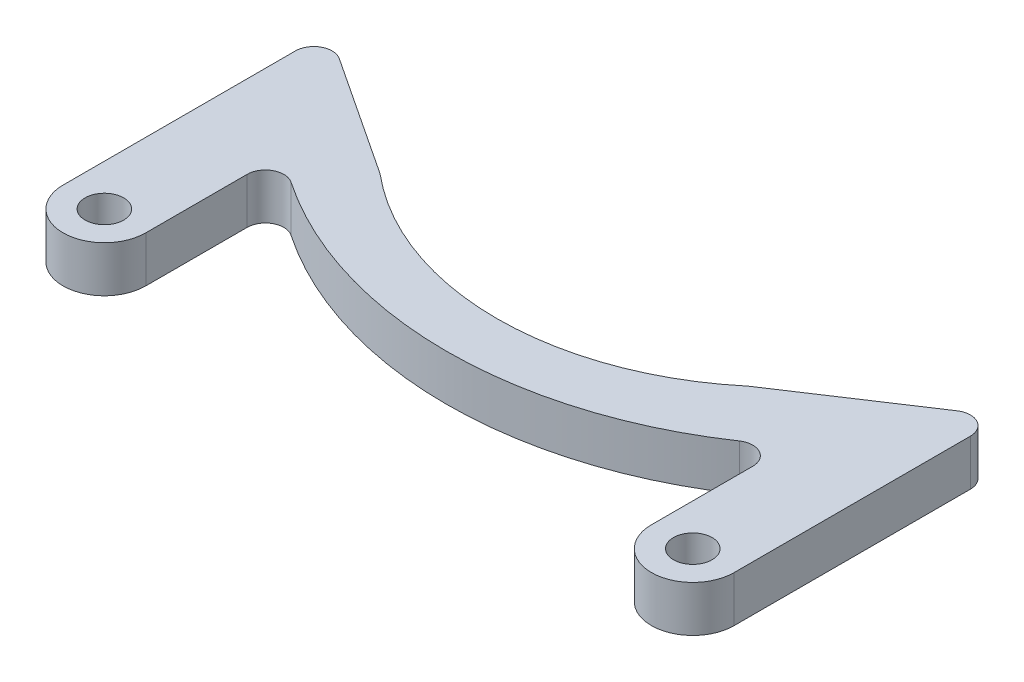
ISO-10303-21;
HEADER;
FILE_DESCRIPTION(('STEP AP214'),'2;1');
FILE_NAME('part.step','',(''),(''),'','','');
FILE_SCHEMA(('AUTOMOTIVE_DESIGN { 1 0 10303 214 1 1 1 1 }'));
ENDSEC;
DATA;
#1=APPLICATION_CONTEXT('core data for automotive mechanical design processes');
#2=APPLICATION_PROTOCOL_DEFINITION('international standard','automotive_design',2000,#1);
#3=PRODUCT_CONTEXT('',#1,'mechanical');
#4=PRODUCT('Part','Part','',(#3));
#5=PRODUCT_RELATED_PRODUCT_CATEGORY('part','',(#4));
#6=PRODUCT_DEFINITION_FORMATION('','',#4);
#7=PRODUCT_DEFINITION_CONTEXT('part definition',#1,'design');
#8=PRODUCT_DEFINITION('design','',#6,#7);
#9=PRODUCT_DEFINITION_SHAPE('','',#8);
#10=(LENGTH_UNIT() NAMED_UNIT(*) SI_UNIT(.MILLI.,.METRE.));
#11=(NAMED_UNIT(*) PLANE_ANGLE_UNIT() SI_UNIT($,.RADIAN.));
#12=(NAMED_UNIT(*) SI_UNIT($,.STERADIAN.) SOLID_ANGLE_UNIT());
#13=UNCERTAINTY_MEASURE_WITH_UNIT(LENGTH_MEASURE(1.E-05),#10,'distance_accuracy_value','');
#14=(GEOMETRIC_REPRESENTATION_CONTEXT(3) GLOBAL_UNCERTAINTY_ASSIGNED_CONTEXT((#13)) GLOBAL_UNIT_ASSIGNED_CONTEXT((#10,
#11,#12)) REPRESENTATION_CONTEXT('',''));
#15=CARTESIAN_POINT('',(0.,0.,0.));
#16=DIRECTION('',(0.,0.,1.));
#17=DIRECTION('',(1.,0.,0.));
#18=AXIS2_PLACEMENT_3D('',#15,#16,#17);
#19=CARTESIAN_POINT('',(64.,5.,0.));
#20=DIRECTION('',(0.,1.,0.));
#21=DIRECTION('',(0.,0.,1.));
#22=AXIS2_PLACEMENT_3D('',#19,#20,#21);
#23=PLANE('',#22);
#24=CARTESIAN_POINT('',(0.,5.,0.));
#25=DIRECTION('',(0.,1.,0.));
#26=DIRECTION('',(0.,0.,1.));
#27=AXIS2_PLACEMENT_3D('',#24,#25,#26);
#28=CIRCLE('',#27,2.1);
#29=CARTESIAN_POINT('',(0.,5.,2.1));
#30=VERTEX_POINT('',#29);
#31=EDGE_CURVE('E260',#30,#30,#28,.T.);
#32=ORIENTED_EDGE('',*,*,#31,.F.);
#33=EDGE_LOOP('',(#32));
#34=FACE_BOUND('',#33,.T.);
#35=CARTESIAN_POINT('',(31.6788174511621,5.,-42.1094478577218));
#36=DIRECTION('',(0.,-1.,0.));
#37=DIRECTION('',(0.,0.,1.));
#38=AXIS2_PLACEMENT_3D('',#35,#36,#37);
#39=CIRCLE('',#38,31.0894217823574);
#40=CARTESIAN_POINT('',(51.5961770608434,5.,-18.2378971552652));
#41=VERTEX_POINT('',#40);
#42=CARTESIAN_POINT('',(11.7614578414807,5.,-18.2378971552653));
#43=VERTEX_POINT('',#42);
#44=EDGE_CURVE('E288',#41,#43,#39,.T.);
#45=ORIENTED_EDGE('',*,*,#44,.T.);
#46=CARTESIAN_POINT('',(10.4801628885469,5.,-16.7022268639636));
#47=DIRECTION('',(0.,1.,0.));
#48=DIRECTION('',(0.,0.,1.));
#49=AXIS2_PLACEMENT_3D('',#46,#47,#48);
#50=CIRCLE('',#49,2.);
#51=CARTESIAN_POINT('',(11.5824210091156,5.,-18.3710668909406));
#52=VERTEX_POINT('',#51);
#53=EDGE_CURVE('E203',#43,#52,#50,.T.);
#54=ORIENTED_EDGE('',*,*,#53,.T.);
#55=DIRECTION('',(-0.834420013488465,0.,-0.55112906028435));
#56=VECTOR('',#55,1.);
#57=CARTESIAN_POINT('',(11.6771173645926,5.,-18.3085205562857));
#58=LINE('',#57,#56);
#59=CARTESIAN_POINT('',(-1.3977418794313,5.,-26.9443811205393));
#60=VERTEX_POINT('',#59);
#61=EDGE_CURVE('E290',#52,#60,#58,.T.);
#62=ORIENTED_EDGE('',*,*,#61,.T.);
#63=CARTESIAN_POINT('',(-2.5,5.,-25.2755410935624));
#64=DIRECTION('',(0.,1.,0.));
#65=DIRECTION('',(0.,0.,1.));
#66=AXIS2_PLACEMENT_3D('',#63,#64,#65);
#67=CIRCLE('',#66,2.);
#68=CARTESIAN_POINT('',(-4.5,5.,-25.2755410935624));
#69=VERTEX_POINT('',#68);
#70=EDGE_CURVE('E197',#60,#69,#67,.T.);
#71=ORIENTED_EDGE('',*,*,#70,.T.);
#72=DIRECTION('',(0.,0.,1.));
#73=VECTOR('',#72,1.);
#74=CARTESIAN_POINT('',(-4.5,5.,0.));
#75=LINE('',#74,#73);
#76=CARTESIAN_POINT('',(-4.5,5.,0.));
#77=VERTEX_POINT('',#76);
#78=EDGE_CURVE('E295',#69,#77,#75,.T.);
#79=ORIENTED_EDGE('',*,*,#78,.T.);
#80=CARTESIAN_POINT('',(0.,5.,0.));
#81=DIRECTION('',(0.,1.,0.));
#82=DIRECTION('',(0.,0.,1.));
#83=AXIS2_PLACEMENT_3D('',#80,#81,#82);
#84=CIRCLE('',#83,4.5);
#85=CARTESIAN_POINT('',(4.5,5.,0.));
#86=VERTEX_POINT('',#85);
#87=EDGE_CURVE('E254',#77,#86,#84,.T.);
#88=ORIENTED_EDGE('',*,*,#87,.T.);
#89=DIRECTION('',(0.,0.,-1.));
#90=VECTOR('',#89,1.);
#91=CARTESIAN_POINT('',(4.5,5.,0.));
#92=LINE('',#91,#90);
#93=CARTESIAN_POINT('',(4.5,5.,-11.0208497915444));
#94=VERTEX_POINT('',#93);
#95=EDGE_CURVE('E249',#86,#94,#92,.T.);
#96=ORIENTED_EDGE('',*,*,#95,.T.);
#97=CARTESIAN_POINT('',(6.5,5.,-11.0208497915444));
#98=DIRECTION('',(0.,1.,0.));
#99=DIRECTION('',(0.,0.,1.));
#100=AXIS2_PLACEMENT_3D('',#97,#98,#99);
#101=CIRCLE('',#100,2.);
#102=CARTESIAN_POINT('',(7.6211343297653,5.,-12.6770677164026));
#103=VERTEX_POINT('',#102);
#104=EDGE_CURVE('E11',#94,#103,#101,.F.);
#105=ORIENTED_EDGE('',*,*,#104,.T.);
#106=CARTESIAN_POINT('',(32.,5.,-48.6912305502231));
#107=DIRECTION('',(0.,1.,0.));
#108=DIRECTION('',(0.,0.,1.));
#109=AXIS2_PLACEMENT_3D('',#106,#107,#108);
#110=CIRCLE('',#109,43.4896426288868);
#111=CARTESIAN_POINT('',(56.3788656702347,5.,-12.6770677164026));
#112=VERTEX_POINT('',#111);
#113=EDGE_CURVE('E248',#103,#112,#110,.T.);
#114=ORIENTED_EDGE('',*,*,#113,.T.);
#115=CARTESIAN_POINT('',(57.5,5.,-11.0208497915444));
#116=DIRECTION('',(0.,1.,0.));
#117=DIRECTION('',(0.,0.,1.));
#118=AXIS2_PLACEMENT_3D('',#115,#116,#117);
#119=CIRCLE('',#118,2.);
#120=CARTESIAN_POINT('',(59.5,5.,-11.0208497915444));
#121=VERTEX_POINT('',#120);
#122=EDGE_CURVE('E48',#112,#121,#119,.F.);
#123=ORIENTED_EDGE('',*,*,#122,.T.);
#124=DIRECTION('',(0.,0.,1.));
#125=VECTOR('',#124,1.);
#126=CARTESIAN_POINT('',(59.5,5.,0.));
#127=LINE('',#126,#125);
#128=CARTESIAN_POINT('',(59.5,5.,0.));
#129=VERTEX_POINT('',#128);
#130=EDGE_CURVE('E163',#121,#129,#127,.T.);
#131=ORIENTED_EDGE('',*,*,#130,.T.);
#132=CARTESIAN_POINT('',(64.,5.,0.));
#133=DIRECTION('',(0.,1.,0.));
#134=DIRECTION('',(0.,0.,1.));
#135=AXIS2_PLACEMENT_3D('',#132,#133,#134);
#136=CIRCLE('',#135,4.5);
#137=CARTESIAN_POINT('',(68.5,5.,0.));
#138=VERTEX_POINT('',#137);
#139=EDGE_CURVE('E158',#129,#138,#136,.T.);
#140=ORIENTED_EDGE('',*,*,#139,.T.);
#141=DIRECTION('',(0.,0.,-1.));
#142=VECTOR('',#141,1.);
#143=CARTESIAN_POINT('',(68.5,5.,0.));
#144=LINE('',#143,#142);
#145=CARTESIAN_POINT('',(68.5,5.,-25.6998191153245));
#146=VERTEX_POINT('',#145);
#147=EDGE_CURVE('E147',#138,#146,#144,.T.);
#148=ORIENTED_EDGE('',*,*,#147,.T.);
#149=CARTESIAN_POINT('',(66.5,5.,-25.6998191153245));
#150=DIRECTION('',(0.,1.,0.));
#151=DIRECTION('',(0.,0.,1.));
#152=AXIS2_PLACEMENT_3D('',#149,#150,#151);
#153=CIRCLE('',#152,2.);
#154=CARTESIAN_POINT('',(65.3977418794313,5.,-27.3686591423014));
#155=VERTEX_POINT('',#154);
#156=EDGE_CURVE('E199',#146,#155,#153,.T.);
#157=ORIENTED_EDGE('',*,*,#156,.T.);
#158=DIRECTION('',(-0.834420013488465,0.,0.55112906028435));
#159=VECTOR('',#158,1.);
#160=CARTESIAN_POINT('',(51.6805175377315,5.,-18.3085205562857));
#161=LINE('',#160,#159);
#162=CARTESIAN_POINT('',(51.7752138932084,5.,-18.3710668909405));
#163=VERTEX_POINT('',#162);
#164=EDGE_CURVE('E157',#155,#163,#161,.T.);
#165=ORIENTED_EDGE('',*,*,#164,.T.);
#166=CARTESIAN_POINT('',(52.8774720137772,5.,-16.7022268639636));
#167=DIRECTION('',(0.,1.,0.));
#168=DIRECTION('',(0.,0.,1.));
#169=AXIS2_PLACEMENT_3D('',#166,#167,#168);
#170=CIRCLE('',#169,2.);
#171=EDGE_CURVE('E201',#163,#41,#170,.T.);
#172=ORIENTED_EDGE('',*,*,#171,.T.);
#173=EDGE_LOOP('',(#45,#54,#62,#71,#79,#88,#96,#105,#114,#123,#131,#140,#148,#157,#165,#172));
#174=FACE_BOUND('',#173,.T.);
#175=CARTESIAN_POINT('',(64.,5.,0.));
#176=DIRECTION('',(0.,1.,0.));
#177=DIRECTION('',(0.,0.,1.));
#178=AXIS2_PLACEMENT_3D('',#175,#176,#177);
#179=CIRCLE('',#178,2.1);
#180=CARTESIAN_POINT('',(64.,5.,2.1));
#181=VERTEX_POINT('',#180);
#182=EDGE_CURVE('E500',#181,#181,#179,.T.);
#183=ORIENTED_EDGE('',*,*,#182,.F.);
#184=EDGE_LOOP('',(#183));
#185=FACE_BOUND('',#184,.T.);
#186=ADVANCED_FACE('F33',(#34,#174,#185),#23,.T.);
#187=CARTESIAN_POINT('',(64.,0.,0.));
#188=DIRECTION('',(0.,1.,0.));
#189=DIRECTION('',(0.,0.,1.));
#190=AXIS2_PLACEMENT_3D('',#187,#188,#189);
#191=PLANE('',#190);
#192=DIRECTION('',(-0.834420013488465,0.,-0.55112906028435));
#193=VECTOR('',#192,1.);
#194=CARTESIAN_POINT('',(11.6771173645926,0.,-18.3085205562857));
#195=LINE('',#194,#193);
#196=CARTESIAN_POINT('',(11.5824210091156,0.,-18.3710668909406));
#197=VERTEX_POINT('',#196);
#198=CARTESIAN_POINT('',(-1.3977418794313,0.,-26.9443811205393));
#199=VERTEX_POINT('',#198);
#200=EDGE_CURVE('E268',#197,#199,#195,.T.);
#201=ORIENTED_EDGE('',*,*,#200,.F.);
#202=CARTESIAN_POINT('',(10.4801628885469,0.,-16.7022268639636));
#203=DIRECTION('',(0.,1.,0.));
#204=DIRECTION('',(0.,0.,1.));
#205=AXIS2_PLACEMENT_3D('',#202,#203,#204);
#206=CIRCLE('',#205,2.);
#207=CARTESIAN_POINT('',(11.7614578414807,0.,-18.2378971552653));
#208=VERTEX_POINT('',#207);
#209=EDGE_CURVE('E190',#197,#208,#206,.F.);
#210=ORIENTED_EDGE('',*,*,#209,.T.);
#211=CARTESIAN_POINT('',(31.6788174511621,0.,-42.1094478577218));
#212=DIRECTION('',(0.,-1.,0.));
#213=DIRECTION('',(0.,0.,1.));
#214=AXIS2_PLACEMENT_3D('',#211,#212,#213);
#215=CIRCLE('',#214,31.0894217823574);
#216=CARTESIAN_POINT('',(51.5961770608434,0.,-18.2378971552652));
#217=VERTEX_POINT('',#216);
#218=EDGE_CURVE('E265',#217,#208,#215,.T.);
#219=ORIENTED_EDGE('',*,*,#218,.F.);
#220=CARTESIAN_POINT('',(52.8774720137772,0.,-16.7022268639636));
#221=DIRECTION('',(0.,1.,0.));
#222=DIRECTION('',(0.,0.,1.));
#223=AXIS2_PLACEMENT_3D('',#220,#221,#222);
#224=CIRCLE('',#223,2.);
#225=CARTESIAN_POINT('',(51.7752138932084,0.,-18.3710668909405));
#226=VERTEX_POINT('',#225);
#227=EDGE_CURVE('E188',#217,#226,#224,.F.);
#228=ORIENTED_EDGE('',*,*,#227,.T.);
#229=DIRECTION('',(-0.834420013488465,0.,0.55112906028435));
#230=VECTOR('',#229,1.);
#231=CARTESIAN_POINT('',(51.6805175377315,0.,-18.3085205562857));
#232=LINE('',#231,#230);
#233=CARTESIAN_POINT('',(65.3977418794313,0.,-27.3686591423014));
#234=VERTEX_POINT('',#233);
#235=EDGE_CURVE('E262',#234,#226,#232,.T.);
#236=ORIENTED_EDGE('',*,*,#235,.F.);
#237=CARTESIAN_POINT('',(66.5,0.,-25.6998191153245));
#238=DIRECTION('',(0.,1.,0.));
#239=DIRECTION('',(0.,0.,1.));
#240=AXIS2_PLACEMENT_3D('',#237,#238,#239);
#241=CIRCLE('',#240,2.);
#242=CARTESIAN_POINT('',(68.5,0.,-25.6998191153245));
#243=VERTEX_POINT('',#242);
#244=EDGE_CURVE('E186',#234,#243,#241,.F.);
#245=ORIENTED_EDGE('',*,*,#244,.T.);
#246=DIRECTION('',(0.,0.,-1.));
#247=VECTOR('',#246,1.);
#248=CARTESIAN_POINT('',(68.5,0.,-29.4176807083118));
#249=LINE('',#248,#247);
#250=CARTESIAN_POINT('',(68.5,0.,0.));
#251=VERTEX_POINT('',#250);
#252=EDGE_CURVE('E259',#251,#243,#249,.T.);
#253=ORIENTED_EDGE('',*,*,#252,.F.);
#254=CARTESIAN_POINT('',(64.,0.,0.));
#255=DIRECTION('',(0.,1.,0.));
#256=DIRECTION('',(0.,0.,1.));
#257=AXIS2_PLACEMENT_3D('',#254,#255,#256);
#258=CIRCLE('',#257,4.5);
#259=CARTESIAN_POINT('',(59.5,0.,0.));
#260=VERTEX_POINT('',#259);
#261=EDGE_CURVE('E171',#260,#251,#258,.T.);
#262=ORIENTED_EDGE('',*,*,#261,.F.);
#263=DIRECTION('',(0.,0.,1.));
#264=VECTOR('',#263,1.);
#265=CARTESIAN_POINT('',(59.5,0.,0.));
#266=LINE('',#265,#264);
#267=CARTESIAN_POINT('',(59.5,0.,-11.0208497915444));
#268=VERTEX_POINT('',#267);
#269=EDGE_CURVE('E167',#268,#260,#266,.T.);
#270=ORIENTED_EDGE('',*,*,#269,.F.);
#271=CARTESIAN_POINT('',(57.5,0.,-11.0208497915444));
#272=DIRECTION('',(0.,1.,0.));
#273=DIRECTION('',(0.,0.,1.));
#274=AXIS2_PLACEMENT_3D('',#271,#272,#273);
#275=CIRCLE('',#274,2.);
#276=CARTESIAN_POINT('',(56.3788656702347,0.,-12.6770677164026));
#277=VERTEX_POINT('',#276);
#278=EDGE_CURVE('E223',#268,#277,#275,.T.);
#279=ORIENTED_EDGE('',*,*,#278,.T.);
#280=CARTESIAN_POINT('',(32.,0.,-48.6912305502231));
#281=DIRECTION('',(0.,1.,0.));
#282=DIRECTION('',(0.,0.,1.));
#283=AXIS2_PLACEMENT_3D('',#280,#281,#282);
#284=CIRCLE('',#283,43.4896426288868);
#285=CARTESIAN_POINT('',(7.6211343297653,0.,-12.6770677164026));
#286=VERTEX_POINT('',#285);
#287=EDGE_CURVE('E234',#286,#277,#284,.T.);
#288=ORIENTED_EDGE('',*,*,#287,.F.);
#289=CARTESIAN_POINT('',(6.5,0.,-11.0208497915444));
#290=DIRECTION('',(0.,1.,0.));
#291=DIRECTION('',(0.,0.,1.));
#292=AXIS2_PLACEMENT_3D('',#289,#290,#291);
#293=CIRCLE('',#292,2.);
#294=CARTESIAN_POINT('',(4.5,0.,-11.0208497915444));
#295=VERTEX_POINT('',#294);
#296=EDGE_CURVE('E41',#286,#295,#293,.T.);
#297=ORIENTED_EDGE('',*,*,#296,.T.);
#298=DIRECTION('',(0.,0.,-1.));
#299=VECTOR('',#298,1.);
#300=CARTESIAN_POINT('',(4.5,0.,0.));
#301=LINE('',#300,#299);
#302=CARTESIAN_POINT('',(4.5,0.,0.));
#303=VERTEX_POINT('',#302);
#304=EDGE_CURVE('E233',#303,#295,#301,.T.);
#305=ORIENTED_EDGE('',*,*,#304,.F.);
#306=CARTESIAN_POINT('',(0.,0.,0.));
#307=DIRECTION('',(0.,1.,0.));
#308=DIRECTION('',(0.,0.,1.));
#309=AXIS2_PLACEMENT_3D('',#306,#307,#308);
#310=CIRCLE('',#309,4.5);
#311=CARTESIAN_POINT('',(-4.5,0.,0.));
#312=VERTEX_POINT('',#311);
#313=EDGE_CURVE('E244',#312,#303,#310,.T.);
#314=ORIENTED_EDGE('',*,*,#313,.F.);
#315=DIRECTION('',(0.,0.,1.));
#316=VECTOR('',#315,1.);
#317=CARTESIAN_POINT('',(-4.5,0.,0.));
#318=LINE('',#317,#316);
#319=CARTESIAN_POINT('',(-4.5,0.,-25.2755410935624));
#320=VERTEX_POINT('',#319);
#321=EDGE_CURVE('E271',#320,#312,#318,.T.);
#322=ORIENTED_EDGE('',*,*,#321,.F.);
#323=CARTESIAN_POINT('',(-2.5,0.,-25.2755410935624));
#324=DIRECTION('',(0.,1.,0.));
#325=DIRECTION('',(0.,0.,1.));
#326=AXIS2_PLACEMENT_3D('',#323,#324,#325);
#327=CIRCLE('',#326,2.);
#328=EDGE_CURVE('E184',#320,#199,#327,.F.);
#329=ORIENTED_EDGE('',*,*,#328,.T.);
#330=EDGE_LOOP('',(#201,#210,#219,#228,#236,#245,#253,#262,#270,#279,#288,#297,#305,#314,#322,#329));
#331=FACE_BOUND('',#330,.T.);
#332=CARTESIAN_POINT('',(0.,0.,0.));
#333=DIRECTION('',(0.,1.,0.));
#334=DIRECTION('',(0.,0.,1.));
#335=AXIS2_PLACEMENT_3D('',#332,#333,#334);
#336=CIRCLE('',#335,2.1);
#337=CARTESIAN_POINT('',(0.,0.,2.1));
#338=VERTEX_POINT('',#337);
#339=EDGE_CURVE('E506',#338,#338,#336,.T.);
#340=ORIENTED_EDGE('',*,*,#339,.T.);
#341=EDGE_LOOP('',(#340));
#342=FACE_BOUND('',#341,.T.);
#343=CARTESIAN_POINT('',(64.,0.,0.));
#344=DIRECTION('',(0.,1.,0.));
#345=DIRECTION('',(0.,0.,1.));
#346=AXIS2_PLACEMENT_3D('',#343,#344,#345);
#347=CIRCLE('',#346,2.1);
#348=CARTESIAN_POINT('',(64.,0.,2.1));
#349=VERTEX_POINT('',#348);
#350=EDGE_CURVE('E503',#349,#349,#347,.T.);
#351=ORIENTED_EDGE('',*,*,#350,.T.);
#352=EDGE_LOOP('',(#351));
#353=FACE_BOUND('',#352,.T.);
#354=ADVANCED_FACE('F230',(#331,#342,#353),#191,.F.);
#355=CARTESIAN_POINT('',(64.,5.,0.));
#356=DIRECTION('',(0.,-1.,0.));
#357=DIRECTION('',(0.,0.,-1.));
#358=AXIS2_PLACEMENT_3D('',#355,#356,#357);
#359=CYLINDRICAL_SURFACE('',#358,4.5);
#360=ORIENTED_EDGE('',*,*,#261,.T.);
#361=DIRECTION('',(0.,-1.,0.));
#362=VECTOR('',#361,1.);
#363=CARTESIAN_POINT('',(68.5,5.,0.));
#364=LINE('',#363,#362);
#365=EDGE_CURVE('E152',#138,#251,#364,.T.);
#366=ORIENTED_EDGE('',*,*,#365,.F.);
#367=ORIENTED_EDGE('',*,*,#139,.F.);
#368=DIRECTION('',(0.,-1.,0.));
#369=VECTOR('',#368,1.);
#370=CARTESIAN_POINT('',(59.5,5.,0.));
#371=LINE('',#370,#369);
#372=EDGE_CURVE('E252',#129,#260,#371,.T.);
#373=ORIENTED_EDGE('',*,*,#372,.T.);
#374=EDGE_LOOP('',(#360,#366,#367,#373));
#375=FACE_BOUND('',#374,.T.);
#376=ADVANCED_FACE('F169',(#375),#359,.T.);
#377=CARTESIAN_POINT('',(68.5,5.,-29.4176807083118));
#378=DIRECTION('',(-1.,0.,0.));
#379=DIRECTION('',(0.,0.,1.));
#380=AXIS2_PLACEMENT_3D('',#377,#378,#379);
#381=PLANE('',#380);
#382=ORIENTED_EDGE('',*,*,#252,.T.);
#383=DIRECTION('',(0.,-1.,0.));
#384=VECTOR('',#383,1.);
#385=CARTESIAN_POINT('',(68.5,5.,-25.6998191153245));
#386=LINE('',#385,#384);
#387=EDGE_CURVE('E155',#243,#146,#386,.F.);
#388=ORIENTED_EDGE('',*,*,#387,.T.);
#389=ORIENTED_EDGE('',*,*,#147,.F.);
#390=ORIENTED_EDGE('',*,*,#365,.T.);
#391=EDGE_LOOP('',(#382,#388,#389,#390));
#392=FACE_BOUND('',#391,.T.);
#393=ADVANCED_FACE('F150',(#392),#381,.F.);
#394=CARTESIAN_POINT('',(51.6805175377315,5.,-18.3085205562857));
#395=DIRECTION('',(0.55112906028435,0.,0.834420013488465));
#396=DIRECTION('',(0.834420013488465,0.,-0.55112906028435));
#397=AXIS2_PLACEMENT_3D('',#394,#395,#396);
#398=PLANE('',#397);
#399=ORIENTED_EDGE('',*,*,#235,.T.);
#400=DIRECTION('',(0.,-1.,0.));
#401=VECTOR('',#400,1.);
#402=CARTESIAN_POINT('',(51.7752138932084,5.,-18.3710668909405));
#403=LINE('',#402,#401);
#404=EDGE_CURVE('E208',#226,#163,#403,.F.);
#405=ORIENTED_EDGE('',*,*,#404,.T.);
#406=ORIENTED_EDGE('',*,*,#164,.F.);
#407=DIRECTION('',(0.,-1.,0.));
#408=VECTOR('',#407,1.);
#409=CARTESIAN_POINT('',(65.3977418794313,5.,-27.3686591423014));
#410=LINE('',#409,#408);
#411=EDGE_CURVE('E205',#155,#234,#410,.T.);
#412=ORIENTED_EDGE('',*,*,#411,.T.);
#413=EDGE_LOOP('',(#399,#405,#406,#412));
#414=FACE_BOUND('',#413,.T.);
#415=ADVANCED_FACE('F286',(#414),#398,.F.);
#416=CARTESIAN_POINT('',(31.6788174511621,5.,-42.1094478577218));
#417=DIRECTION('',(0.,-1.,0.));
#418=DIRECTION('',(0.,0.,-1.));
#419=AXIS2_PLACEMENT_3D('',#416,#417,#418);
#420=CYLINDRICAL_SURFACE('',#419,31.0894217823574);
#421=ORIENTED_EDGE('',*,*,#218,.T.);
#422=DIRECTION('',(0.,-1.,0.));
#423=VECTOR('',#422,1.);
#424=CARTESIAN_POINT('',(11.7614578414807,5.,-18.2378971552653));
#425=LINE('',#424,#423);
#426=EDGE_CURVE('E195',#208,#43,#425,.F.);
#427=ORIENTED_EDGE('',*,*,#426,.T.);
#428=ORIENTED_EDGE('',*,*,#44,.F.);
#429=DIRECTION('',(0.,-1.,0.));
#430=VECTOR('',#429,1.);
#431=CARTESIAN_POINT('',(51.5961770608434,5.,-18.2378971552652));
#432=LINE('',#431,#430);
#433=EDGE_CURVE('E192',#41,#217,#432,.T.);
#434=ORIENTED_EDGE('',*,*,#433,.T.);
#435=EDGE_LOOP('',(#421,#427,#428,#434));
#436=FACE_BOUND('',#435,.T.);
#437=ADVANCED_FACE('F319',(#436),#420,.F.);
#438=CARTESIAN_POINT('',(11.6771173645926,5.,-18.3085205562857));
#439=DIRECTION('',(-0.55112906028435,0.,0.834420013488465));
#440=DIRECTION('',(0.834420013488465,0.,0.55112906028435));
#441=AXIS2_PLACEMENT_3D('',#438,#439,#440);
#442=PLANE('',#441);
#443=ORIENTED_EDGE('',*,*,#61,.F.);
#444=DIRECTION('',(0.,-1.,0.));
#445=VECTOR('',#444,1.);
#446=CARTESIAN_POINT('',(11.5824210091156,5.,-18.3710668909406));
#447=LINE('',#446,#445);
#448=EDGE_CURVE('E175',#52,#197,#447,.T.);
#449=ORIENTED_EDGE('',*,*,#448,.T.);
#450=ORIENTED_EDGE('',*,*,#200,.T.);
#451=DIRECTION('',(0.,-1.,0.));
#452=VECTOR('',#451,1.);
#453=CARTESIAN_POINT('',(-1.3977418794313,5.,-26.9443811205393));
#454=LINE('',#453,#452);
#455=EDGE_CURVE('E172',#199,#60,#454,.F.);
#456=ORIENTED_EDGE('',*,*,#455,.T.);
#457=EDGE_LOOP('',(#443,#449,#450,#456));
#458=FACE_BOUND('',#457,.T.);
#459=ADVANCED_FACE('F310',(#458),#442,.F.);
#460=CARTESIAN_POINT('',(-4.5,5.,0.));
#461=DIRECTION('',(1.,0.,0.));
#462=DIRECTION('',(0.,0.,-1.));
#463=AXIS2_PLACEMENT_3D('',#460,#461,#462);
#464=PLANE('',#463);
#465=ORIENTED_EDGE('',*,*,#78,.F.);
#466=DIRECTION('',(0.,-1.,0.));
#467=VECTOR('',#466,1.);
#468=CARTESIAN_POINT('',(-4.5,5.,-25.2755410935624));
#469=LINE('',#468,#467);
#470=EDGE_CURVE('E220',#69,#320,#469,.T.);
#471=ORIENTED_EDGE('',*,*,#470,.T.);
#472=ORIENTED_EDGE('',*,*,#321,.T.);
#473=DIRECTION('',(0.,-1.,0.));
#474=VECTOR('',#473,1.);
#475=CARTESIAN_POINT('',(-4.5,5.,0.));
#476=LINE('',#475,#474);
#477=EDGE_CURVE('E173',#77,#312,#476,.T.);
#478=ORIENTED_EDGE('',*,*,#477,.F.);
#479=EDGE_LOOP('',(#465,#471,#472,#478));
#480=FACE_BOUND('',#479,.T.);
#481=ADVANCED_FACE('F303',(#480),#464,.F.);
#482=CARTESIAN_POINT('',(0.,5.,0.));
#483=DIRECTION('',(0.,-1.,0.));
#484=DIRECTION('',(0.,0.,-1.));
#485=AXIS2_PLACEMENT_3D('',#482,#483,#484);
#486=CYLINDRICAL_SURFACE('',#485,4.5);
#487=ORIENTED_EDGE('',*,*,#313,.T.);
#488=DIRECTION('',(0.,-1.,0.));
#489=VECTOR('',#488,1.);
#490=CARTESIAN_POINT('',(4.5,5.,0.));
#491=LINE('',#490,#489);
#492=EDGE_CURVE('E178',#86,#303,#491,.T.);
#493=ORIENTED_EDGE('',*,*,#492,.F.);
#494=ORIENTED_EDGE('',*,*,#87,.F.);
#495=ORIENTED_EDGE('',*,*,#477,.T.);
#496=EDGE_LOOP('',(#487,#493,#494,#495));
#497=FACE_BOUND('',#496,.T.);
#498=ADVANCED_FACE('F300',(#497),#486,.T.);
#499=CARTESIAN_POINT('',(4.5,5.,0.));
#500=DIRECTION('',(-1.,0.,0.));
#501=DIRECTION('',(0.,0.,1.));
#502=AXIS2_PLACEMENT_3D('',#499,#500,#501);
#503=PLANE('',#502);
#504=ORIENTED_EDGE('',*,*,#304,.T.);
#505=DIRECTION('',(0.,1.,0.));
#506=VECTOR('',#505,1.);
#507=CARTESIAN_POINT('',(4.5,5.,-11.0208497915444));
#508=LINE('',#507,#506);
#509=EDGE_CURVE('E218',#295,#94,#508,.T.);
#510=ORIENTED_EDGE('',*,*,#509,.T.);
#511=ORIENTED_EDGE('',*,*,#95,.F.);
#512=ORIENTED_EDGE('',*,*,#492,.T.);
#513=EDGE_LOOP('',(#504,#510,#511,#512));
#514=FACE_BOUND('',#513,.T.);
#515=ADVANCED_FACE('F240',(#514),#503,.F.);
#516=CARTESIAN_POINT('',(32.,5.,-48.6912305502231));
#517=DIRECTION('',(0.,-1.,0.));
#518=DIRECTION('',(0.,0.,-1.));
#519=AXIS2_PLACEMENT_3D('',#516,#517,#518);
#520=CYLINDRICAL_SURFACE('',#519,43.4896426288868);
#521=ORIENTED_EDGE('',*,*,#287,.T.);
#522=DIRECTION('',(0.,-1.,0.));
#523=VECTOR('',#522,1.);
#524=CARTESIAN_POINT('',(56.3788656702347,5.,-12.6770677164026));
#525=LINE('',#524,#523);
#526=EDGE_CURVE('E56',#277,#112,#525,.F.);
#527=ORIENTED_EDGE('',*,*,#526,.T.);
#528=ORIENTED_EDGE('',*,*,#113,.F.);
#529=DIRECTION('',(0.,-1.,0.));
#530=VECTOR('',#529,1.);
#531=CARTESIAN_POINT('',(7.6211343297653,5.,-12.6770677164026));
#532=LINE('',#531,#530);
#533=EDGE_CURVE('E214',#103,#286,#532,.T.);
#534=ORIENTED_EDGE('',*,*,#533,.T.);
#535=EDGE_LOOP('',(#521,#527,#528,#534));
#536=FACE_BOUND('',#535,.T.);
#537=ADVANCED_FACE('F250',(#536),#520,.T.);
#538=CARTESIAN_POINT('',(59.5,5.,0.));
#539=DIRECTION('',(1.,0.,0.));
#540=DIRECTION('',(0.,0.,-1.));
#541=AXIS2_PLACEMENT_3D('',#538,#539,#540);
#542=PLANE('',#541);
#543=ORIENTED_EDGE('',*,*,#130,.F.);
#544=DIRECTION('',(0.,1.,0.));
#545=VECTOR('',#544,1.);
#546=CARTESIAN_POINT('',(59.5,0.,-11.0208497915444));
#547=LINE('',#546,#545);
#548=EDGE_CURVE('E211',#121,#268,#547,.F.);
#549=ORIENTED_EDGE('',*,*,#548,.T.);
#550=ORIENTED_EDGE('',*,*,#269,.T.);
#551=ORIENTED_EDGE('',*,*,#372,.F.);
#552=EDGE_LOOP('',(#543,#549,#550,#551));
#553=FACE_BOUND('',#552,.T.);
#554=ADVANCED_FACE('F345',(#553),#542,.F.);
#555=CARTESIAN_POINT('',(0.,5.,0.));
#556=DIRECTION('',(0.,-1.,0.));
#557=DIRECTION('',(0.,0.,-1.));
#558=AXIS2_PLACEMENT_3D('',#555,#556,#557);
#559=CYLINDRICAL_SURFACE('',#558,2.1);
#560=ORIENTED_EDGE('',*,*,#31,.T.);
#561=EDGE_LOOP('',(#560));
#562=FACE_BOUND('',#561,.T.);
#563=ORIENTED_EDGE('',*,*,#339,.F.);
#564=EDGE_LOOP('',(#563));
#565=FACE_BOUND('',#564,.T.);
#566=ADVANCED_FACE('F342',(#562,#565),#559,.F.);
#567=CARTESIAN_POINT('',(64.,5.,0.));
#568=DIRECTION('',(0.,-1.,0.));
#569=DIRECTION('',(0.,0.,-1.));
#570=AXIS2_PLACEMENT_3D('',#567,#568,#569);
#571=CYLINDRICAL_SURFACE('',#570,2.1);
#572=ORIENTED_EDGE('',*,*,#182,.T.);
#573=EDGE_LOOP('',(#572));
#574=FACE_BOUND('',#573,.T.);
#575=ORIENTED_EDGE('',*,*,#350,.F.);
#576=EDGE_LOOP('',(#575));
#577=FACE_BOUND('',#576,.T.);
#578=ADVANCED_FACE('F331',(#574,#577),#571,.F.);
#579=CARTESIAN_POINT('',(10.4801628885469,5.,-16.7022268639636));
#580=DIRECTION('',(0.,-1.,0.));
#581=DIRECTION('',(0.,0.,-1.));
#582=AXIS2_PLACEMENT_3D('',#579,#580,#581);
#583=CYLINDRICAL_SURFACE('',#582,2.);
#584=ORIENTED_EDGE('',*,*,#53,.F.);
#585=ORIENTED_EDGE('',*,*,#426,.F.);
#586=ORIENTED_EDGE('',*,*,#209,.F.);
#587=ORIENTED_EDGE('',*,*,#448,.F.);
#588=EDGE_LOOP('',(#584,#585,#586,#587));
#589=FACE_BOUND('',#588,.T.);
#590=ADVANCED_FACE('F316',(#589),#583,.T.);
#591=CARTESIAN_POINT('',(52.8774720137772,5.,-16.7022268639636));
#592=DIRECTION('',(0.,-1.,0.));
#593=DIRECTION('',(0.,0.,-1.));
#594=AXIS2_PLACEMENT_3D('',#591,#592,#593);
#595=CYLINDRICAL_SURFACE('',#594,2.);
#596=ORIENTED_EDGE('',*,*,#171,.F.);
#597=ORIENTED_EDGE('',*,*,#404,.F.);
#598=ORIENTED_EDGE('',*,*,#227,.F.);
#599=ORIENTED_EDGE('',*,*,#433,.F.);
#600=EDGE_LOOP('',(#596,#597,#598,#599));
#601=FACE_BOUND('',#600,.T.);
#602=ADVANCED_FACE('F322',(#601),#595,.T.);
#603=CARTESIAN_POINT('',(66.5,5.,-25.6998191153245));
#604=DIRECTION('',(0.,-1.,0.));
#605=DIRECTION('',(0.,0.,-1.));
#606=AXIS2_PLACEMENT_3D('',#603,#604,#605);
#607=CYLINDRICAL_SURFACE('',#606,2.);
#608=ORIENTED_EDGE('',*,*,#156,.F.);
#609=ORIENTED_EDGE('',*,*,#387,.F.);
#610=ORIENTED_EDGE('',*,*,#244,.F.);
#611=ORIENTED_EDGE('',*,*,#411,.F.);
#612=EDGE_LOOP('',(#608,#609,#610,#611));
#613=FACE_BOUND('',#612,.T.);
#614=ADVANCED_FACE('F280',(#613),#607,.T.);
#615=CARTESIAN_POINT('',(57.5,5.,-11.0208497915444));
#616=DIRECTION('',(0.,-1.,0.));
#617=DIRECTION('',(0.,0.,-1.));
#618=AXIS2_PLACEMENT_3D('',#615,#616,#617);
#619=CYLINDRICAL_SURFACE('',#618,2.);
#620=ORIENTED_EDGE('',*,*,#122,.F.);
#621=ORIENTED_EDGE('',*,*,#526,.F.);
#622=ORIENTED_EDGE('',*,*,#278,.F.);
#623=ORIENTED_EDGE('',*,*,#548,.F.);
#624=EDGE_LOOP('',(#620,#621,#622,#623));
#625=FACE_BOUND('',#624,.T.);
#626=ADVANCED_FACE('F329',(#625),#619,.F.);
#627=CARTESIAN_POINT('',(6.5,5.,-11.0208497915444));
#628=DIRECTION('',(0.,-1.,0.));
#629=DIRECTION('',(0.,0.,-1.));
#630=AXIS2_PLACEMENT_3D('',#627,#628,#629);
#631=CYLINDRICAL_SURFACE('',#630,2.);
#632=ORIENTED_EDGE('',*,*,#104,.F.);
#633=ORIENTED_EDGE('',*,*,#509,.F.);
#634=ORIENTED_EDGE('',*,*,#296,.F.);
#635=ORIENTED_EDGE('',*,*,#533,.F.);
#636=EDGE_LOOP('',(#632,#633,#634,#635));
#637=FACE_BOUND('',#636,.T.);
#638=ADVANCED_FACE('F247',(#637),#631,.F.);
#639=CARTESIAN_POINT('',(-2.5,5.,-25.2755410935624));
#640=DIRECTION('',(0.,-1.,0.));
#641=DIRECTION('',(0.,0.,-1.));
#642=AXIS2_PLACEMENT_3D('',#639,#640,#641);
#643=CYLINDRICAL_SURFACE('',#642,2.);
#644=ORIENTED_EDGE('',*,*,#70,.F.);
#645=ORIENTED_EDGE('',*,*,#455,.F.);
#646=ORIENTED_EDGE('',*,*,#328,.F.);
#647=ORIENTED_EDGE('',*,*,#470,.F.);
#648=EDGE_LOOP('',(#644,#645,#646,#647));
#649=FACE_BOUND('',#648,.T.);
#650=ADVANCED_FACE('F35',(#649),#643,.T.);
#651=CLOSED_SHELL('',(#186,#354,#376,#393,#415,#437,#459,#481,#498,#515,#537,#554,#566,#578,
#590,#602,#614,#626,#638,#650));
#652=MANIFOLD_SOLID_BREP('B2',#651);
#653=ADVANCED_BREP_SHAPE_REPRESENTATION('',(#18,#652),#14);
#654=SHAPE_DEFINITION_REPRESENTATION(#9,#653);
ENDSEC;
END-ISO-10303-21;
